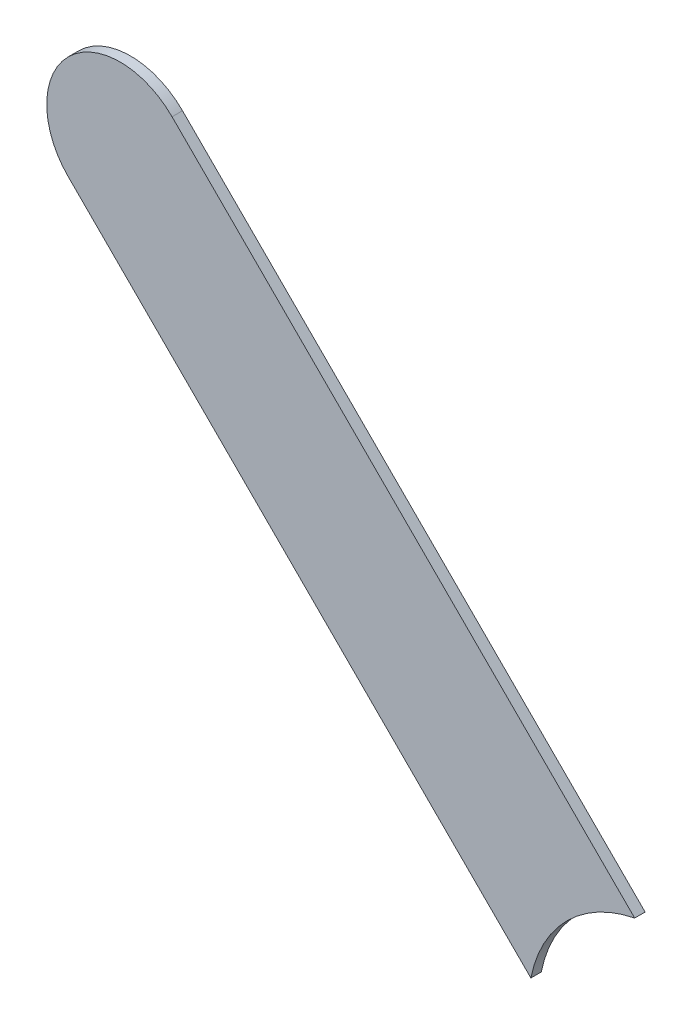
ISO-10303-21;
HEADER;
FILE_DESCRIPTION(('STEP AP214'),'2;1');
FILE_NAME('part.step','',(''),(''),'','','');
FILE_SCHEMA(('AUTOMOTIVE_DESIGN { 1 0 10303 214 1 1 1 1 }'));
ENDSEC;
DATA;
#1=APPLICATION_CONTEXT('core data for automotive mechanical design processes');
#2=APPLICATION_PROTOCOL_DEFINITION('international standard','automotive_design',2000,#1);
#3=PRODUCT_CONTEXT('',#1,'mechanical');
#4=PRODUCT('Part','Part','',(#3));
#5=PRODUCT_RELATED_PRODUCT_CATEGORY('part','',(#4));
#6=PRODUCT_DEFINITION_FORMATION('','',#4);
#7=PRODUCT_DEFINITION_CONTEXT('part definition',#1,'design');
#8=PRODUCT_DEFINITION('design','',#6,#7);
#9=PRODUCT_DEFINITION_SHAPE('','',#8);
#10=(LENGTH_UNIT() NAMED_UNIT(*) SI_UNIT(.MILLI.,.METRE.));
#11=(NAMED_UNIT(*) PLANE_ANGLE_UNIT() SI_UNIT($,.RADIAN.));
#12=(NAMED_UNIT(*) SI_UNIT($,.STERADIAN.) SOLID_ANGLE_UNIT());
#13=UNCERTAINTY_MEASURE_WITH_UNIT(LENGTH_MEASURE(1.E-05),#10,'distance_accuracy_value','');
#14=(GEOMETRIC_REPRESENTATION_CONTEXT(3) GLOBAL_UNCERTAINTY_ASSIGNED_CONTEXT((#13)) GLOBAL_UNIT_ASSIGNED_CONTEXT((#10,
#11,#12)) REPRESENTATION_CONTEXT('',''));
#15=CARTESIAN_POINT('',(0.,0.,0.));
#16=DIRECTION('',(0.,0.,1.));
#17=DIRECTION('',(1.,0.,0.));
#18=AXIS2_PLACEMENT_3D('',#15,#16,#17);
#19=CARTESIAN_POINT('',(115.1832342,66.82322424,0.));
#20=DIRECTION('',(0.707106781186548,0.707106781186548,0.));
#21=DIRECTION('',(0.707106781186548,-0.707106781186548,0.));
#22=AXIS2_PLACEMENT_3D('',#19,#20,#21);
#23=PLANE('',#22);
#24=DIRECTION('',(0.707106781186548,-0.707106781186548,0.));
#25=VECTOR('',#24,1.);
#26=CARTESIAN_POINT('',(115.1832342,66.82322424,0.03556));
#27=LINE('',#26,#25);
#28=CARTESIAN_POINT('',(115.1832342,66.82322424,0.03556));
#29=VERTEX_POINT('',#28);
#30=CARTESIAN_POINT('',(116.758668643605,65.2477897963948,0.03556));
#31=VERTEX_POINT('',#30);
#32=EDGE_CURVE('E11',#29,#31,#27,.T.);
#33=ORIENTED_EDGE('',*,*,#32,.F.);
#34=DIRECTION('',(0.,0.,1.));
#35=VECTOR('',#34,1.);
#36=CARTESIAN_POINT('',(115.1832342,66.82322424,0.));
#37=LINE('',#36,#35);
#38=CARTESIAN_POINT('',(115.1832342,66.82322424,0.));
#39=VERTEX_POINT('',#38);
#40=EDGE_CURVE('E24',#39,#29,#37,.T.);
#41=ORIENTED_EDGE('',*,*,#40,.F.);
#42=DIRECTION('',(0.707106781186548,-0.707106781186548,0.));
#43=VECTOR('',#42,1.);
#44=CARTESIAN_POINT('',(115.1832342,66.82322424,0.));
#45=LINE('',#44,#43);
#46=CARTESIAN_POINT('',(116.758668643605,65.2477897963948,0.));
#47=VERTEX_POINT('',#46);
#48=EDGE_CURVE('E75',#39,#47,#45,.T.);
#49=ORIENTED_EDGE('',*,*,#48,.T.);
#50=DIRECTION('',(0.,0.,1.));
#51=VECTOR('',#50,1.);
#52=CARTESIAN_POINT('',(116.758668643605,65.2477897963948,0.));
#53=LINE('',#52,#51);
#54=EDGE_CURVE('E37',#47,#31,#53,.T.);
#55=ORIENTED_EDGE('',*,*,#54,.T.);
#56=EDGE_LOOP('',(#33,#41,#49,#55));
#57=FACE_BOUND('',#56,.T.);
#58=ADVANCED_FACE('F17',(#57),#23,.F.);
#59=CARTESIAN_POINT('',(117.2000196,65.1599916,0.));
#60=DIRECTION('',(0.,0.,-1.));
#61=DIRECTION('',(1.,0.,0.));
#62=AXIS2_PLACEMENT_3D('',#59,#60,#61);
#63=CYLINDRICAL_SURFACE('',#62,0.4499991);
#64=DIRECTION('',(0.,0.,1.));
#65=VECTOR('',#64,1.);
#66=CARTESIAN_POINT('',(117.112221403605,65.6013425563948,0.));
#67=LINE('',#66,#65);
#68=CARTESIAN_POINT('',(117.112221403605,65.6013425563948,0.));
#69=VERTEX_POINT('',#68);
#70=CARTESIAN_POINT('',(117.112221403605,65.6013425563948,0.03556));
#71=VERTEX_POINT('',#70);
#72=EDGE_CURVE('E67',#69,#71,#67,.T.);
#73=ORIENTED_EDGE('',*,*,#72,.T.);
#74=CARTESIAN_POINT('',(117.2000196,65.1599916,0.03556));
#75=DIRECTION('',(0.,0.,1.));
#76=DIRECTION('',(1.,0.,0.));
#77=AXIS2_PLACEMENT_3D('',#74,#75,#76);
#78=CIRCLE('',#77,0.4499991);
#79=EDGE_CURVE('E82',#71,#31,#78,.T.);
#80=ORIENTED_EDGE('',*,*,#79,.T.);
#81=ORIENTED_EDGE('',*,*,#54,.F.);
#82=CARTESIAN_POINT('',(117.2000196,65.1599916,0.));
#83=DIRECTION('',(0.,0.,1.));
#84=DIRECTION('',(1.,0.,0.));
#85=AXIS2_PLACEMENT_3D('',#82,#83,#84);
#86=CIRCLE('',#85,0.4499991);
#87=EDGE_CURVE('E80',#69,#47,#86,.T.);
#88=ORIENTED_EDGE('',*,*,#87,.F.);
#89=EDGE_LOOP('',(#73,#80,#81,#88));
#90=FACE_BOUND('',#89,.T.);
#91=ADVANCED_FACE('F88',(#90),#63,.F.);
#92=CARTESIAN_POINT('',(117.112221403605,65.6013425563948,0.));
#93=DIRECTION('',(-0.70710678118655,-0.707106781186545,0.));
#94=DIRECTION('',(-0.707106781186545,0.70710678118655,0.));
#95=AXIS2_PLACEMENT_3D('',#92,#93,#94);
#96=PLANE('',#95);
#97=DIRECTION('',(-0.707106781186545,0.70710678118655,0.));
#98=VECTOR('',#97,1.);
#99=CARTESIAN_POINT('',(117.37679598,65.33676798,0.03556));
#100=LINE('',#99,#98);
#101=CARTESIAN_POINT('',(115.53678696,67.176777,0.03556));
#102=VERTEX_POINT('',#101);
#103=EDGE_CURVE('E71',#71,#102,#100,.T.);
#104=ORIENTED_EDGE('',*,*,#103,.F.);
#105=ORIENTED_EDGE('',*,*,#72,.F.);
#106=DIRECTION('',(-0.707106781186545,0.70710678118655,0.));
#107=VECTOR('',#106,1.);
#108=CARTESIAN_POINT('',(117.37679598,65.33676798,0.));
#109=LINE('',#108,#107);
#110=CARTESIAN_POINT('',(115.53678696,67.176777,0.));
#111=VERTEX_POINT('',#110);
#112=EDGE_CURVE('E63',#69,#111,#109,.T.);
#113=ORIENTED_EDGE('',*,*,#112,.T.);
#114=DIRECTION('',(0.,0.,1.));
#115=VECTOR('',#114,1.);
#116=CARTESIAN_POINT('',(115.53678696,67.176777,0.));
#117=LINE('',#116,#115);
#118=EDGE_CURVE('E53',#111,#102,#117,.T.);
#119=ORIENTED_EDGE('',*,*,#118,.T.);
#120=EDGE_LOOP('',(#104,#105,#113,#119));
#121=FACE_BOUND('',#120,.T.);
#122=ADVANCED_FACE('F66',(#121),#96,.F.);
#123=CARTESIAN_POINT('',(115.36001058,67.00000062,0.));
#124=DIRECTION('',(0.,0.,-1.));
#125=DIRECTION('',(0.707106781186548,0.707106781186548,0.));
#126=AXIS2_PLACEMENT_3D('',#123,#124,#125);
#127=CYLINDRICAL_SURFACE('',#126,0.249999554103213);
#128=CARTESIAN_POINT('',(115.36001058,67.00000062,0.03556));
#129=DIRECTION('',(0.,0.,1.));
#130=DIRECTION('',(0.707106781186548,0.707106781186548,0.));
#131=AXIS2_PLACEMENT_3D('',#128,#129,#130);
#132=CIRCLE('',#131,0.249999554103213);
#133=EDGE_CURVE('E59',#102,#29,#132,.T.);
#134=ORIENTED_EDGE('',*,*,#133,.F.);
#135=ORIENTED_EDGE('',*,*,#118,.F.);
#136=CARTESIAN_POINT('',(115.36001058,67.00000062,0.));
#137=DIRECTION('',(0.,0.,1.));
#138=DIRECTION('',(0.707106781186548,0.707106781186548,0.));
#139=AXIS2_PLACEMENT_3D('',#136,#137,#138);
#140=CIRCLE('',#139,0.249999554103213);
#141=EDGE_CURVE('E57',#111,#39,#140,.T.);
#142=ORIENTED_EDGE('',*,*,#141,.T.);
#143=ORIENTED_EDGE('',*,*,#40,.T.);
#144=EDGE_LOOP('',(#134,#135,#142,#143));
#145=FACE_BOUND('',#144,.T.);
#146=ADVANCED_FACE('F55',(#145),#127,.T.);
#147=CARTESIAN_POINT('',(115.1832342,66.82322424,0.));
#148=DIRECTION('',(0.,0.,-1.));
#149=DIRECTION('',(-1.,0.,0.));
#150=AXIS2_PLACEMENT_3D('',#147,#148,#149);
#151=PLANE('',#150);
#152=ORIENTED_EDGE('',*,*,#48,.F.);
#153=ORIENTED_EDGE('',*,*,#141,.F.);
#154=ORIENTED_EDGE('',*,*,#112,.F.);
#155=ORIENTED_EDGE('',*,*,#87,.T.);
#156=EDGE_LOOP('',(#152,#153,#154,#155));
#157=FACE_BOUND('',#156,.T.);
#158=ADVANCED_FACE('F74',(#157),#151,.T.);
#159=CARTESIAN_POINT('',(115.1832342,66.82322424,0.03556));
#160=DIRECTION('',(0.,0.,-1.));
#161=DIRECTION('',(-1.,0.,0.));
#162=AXIS2_PLACEMENT_3D('',#159,#160,#161);
#163=PLANE('',#162);
#164=ORIENTED_EDGE('',*,*,#133,.T.);
#165=ORIENTED_EDGE('',*,*,#32,.T.);
#166=ORIENTED_EDGE('',*,*,#79,.F.);
#167=ORIENTED_EDGE('',*,*,#103,.T.);
#168=EDGE_LOOP('',(#164,#165,#166,#167));
#169=FACE_BOUND('',#168,.T.);
#170=ADVANCED_FACE('F91',(#169),#163,.F.);
#171=CLOSED_SHELL('',(#58,#91,#122,#146,#158,#170));
#172=MANIFOLD_SOLID_BREP('B1',#171);
#173=ADVANCED_BREP_SHAPE_REPRESENTATION('',(#18,#172),#14);
#174=SHAPE_DEFINITION_REPRESENTATION(#9,#173);
ENDSEC;
END-ISO-10303-21;
